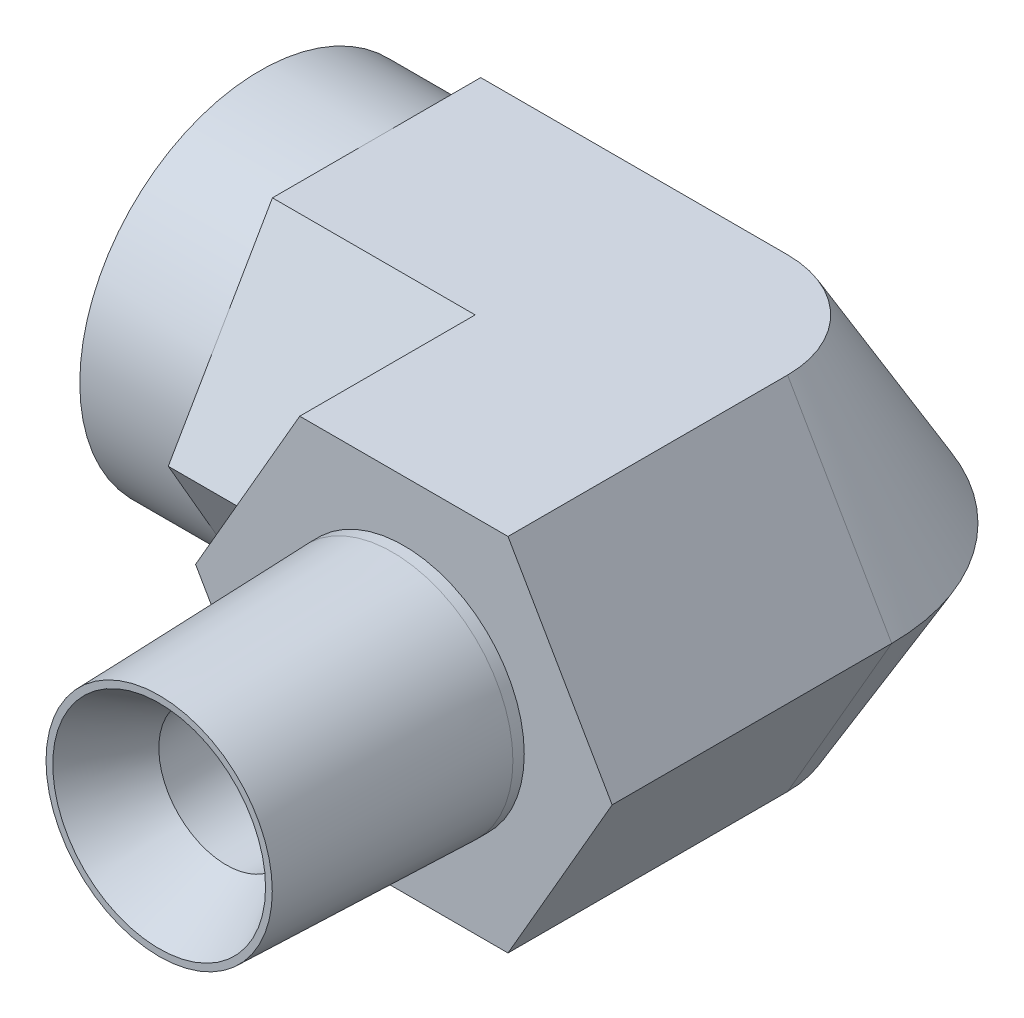
ISO-10303-21;
HEADER;
FILE_DESCRIPTION(('STEP AP214'),'2;1');
FILE_NAME('part.step','',(''),(''),'','','');
FILE_SCHEMA(('AUTOMOTIVE_DESIGN { 1 0 10303 214 1 1 1 1 }'));
ENDSEC;
DATA;
#1=APPLICATION_CONTEXT('core data for automotive mechanical design processes');
#2=APPLICATION_PROTOCOL_DEFINITION('international standard','automotive_design',2000,#1);
#3=PRODUCT_CONTEXT('',#1,'mechanical');
#4=PRODUCT('Part','Part','',(#3));
#5=PRODUCT_RELATED_PRODUCT_CATEGORY('part','',(#4));
#6=PRODUCT_DEFINITION_FORMATION('','',#4);
#7=PRODUCT_DEFINITION_CONTEXT('part definition',#1,'design');
#8=PRODUCT_DEFINITION('design','',#6,#7);
#9=PRODUCT_DEFINITION_SHAPE('','',#8);
#10=(LENGTH_UNIT() NAMED_UNIT(*) SI_UNIT(.MILLI.,.METRE.));
#11=(NAMED_UNIT(*) PLANE_ANGLE_UNIT() SI_UNIT($,.RADIAN.));
#12=(NAMED_UNIT(*) SI_UNIT($,.STERADIAN.) SOLID_ANGLE_UNIT());
#13=UNCERTAINTY_MEASURE_WITH_UNIT(LENGTH_MEASURE(1.E-05),#10,'distance_accuracy_value','');
#14=(GEOMETRIC_REPRESENTATION_CONTEXT(3) GLOBAL_UNCERTAINTY_ASSIGNED_CONTEXT((#13)) GLOBAL_UNIT_ASSIGNED_CONTEXT((#10,
#11,#12)) REPRESENTATION_CONTEXT('',''));
#15=CARTESIAN_POINT('',(0.,0.,0.));
#16=DIRECTION('',(0.,0.,1.));
#17=DIRECTION('',(1.,0.,0.));
#18=AXIS2_PLACEMENT_3D('',#15,#16,#17);
#19=CARTESIAN_POINT('',(-16.2052,0.,0.));
#20=DIRECTION('',(1.,0.,0.));
#21=DIRECTION('',(0.,0.,-1.));
#22=AXIS2_PLACEMENT_3D('',#19,#20,#21);
#23=CYLINDRICAL_SURFACE('',#22,3.5687);
#24=CARTESIAN_POINT('',(0.,0.,0.));
#25=DIRECTION('',(0.707106781186547,0.,0.707106781186547));
#26=DIRECTION('',(0.707106781186547,0.,-0.707106781186547));
#27=AXIS2_PLACEMENT_3D('',#24,#25,#26);
#28=ELLIPSE('',#27,5.04690394004086,3.5687);
#29=CARTESIAN_POINT('',(3.5687,0.,-3.5687));
#30=VERTEX_POINT('',#29);
#31=EDGE_CURVE('E19',#30,#30,#28,.T.);
#32=ORIENTED_EDGE('',*,*,#31,.T.);
#33=EDGE_LOOP('',(#32));
#34=FACE_BOUND('',#33,.T.);
#35=CARTESIAN_POINT('',(-13.716,0.,0.));
#36=DIRECTION('',(1.,0.,0.));
#37=DIRECTION('',(0.,0.,-1.));
#38=AXIS2_PLACEMENT_3D('',#35,#36,#37);
#39=CIRCLE('',#38,3.5687);
#40=CARTESIAN_POINT('',(-13.716,0.,-3.5687));
#41=VERTEX_POINT('',#40);
#42=EDGE_CURVE('E179',#41,#41,#39,.F.);
#43=ORIENTED_EDGE('',*,*,#42,.T.);
#44=EDGE_LOOP('',(#43));
#45=FACE_BOUND('',#44,.T.);
#46=ADVANCED_FACE('F16',(#34,#45),#23,.F.);
#47=CARTESIAN_POINT('',(0.,0.,28.3321125));
#48=DIRECTION('',(0.,0.,-1.));
#49=DIRECTION('',(-1.,0.,0.));
#50=AXIS2_PLACEMENT_3D('',#47,#48,#49);
#51=CYLINDRICAL_SURFACE('',#50,3.5687);
#52=ORIENTED_EDGE('',*,*,#31,.F.);
#53=EDGE_LOOP('',(#52));
#54=FACE_BOUND('',#53,.T.);
#55=CARTESIAN_POINT('',(0.,0.,24.134203093638));
#56=DIRECTION('',(0.,0.,1.));
#57=DIRECTION('',(0.,1.,0.));
#58=AXIS2_PLACEMENT_3D('',#55,#56,#57);
#59=CIRCLE('',#58,3.56870000001663);
#60=CARTESIAN_POINT('',(0.,3.56870000001663,24.134203093638));
#61=VERTEX_POINT('',#60);
#62=EDGE_CURVE('E178',#61,#61,#59,.T.);
#63=ORIENTED_EDGE('',*,*,#62,.T.);
#64=EDGE_LOOP('',(#63));
#65=FACE_BOUND('',#64,.T.);
#66=ADVANCED_FACE('F189',(#54,#65),#51,.F.);
#67=CARTESIAN_POINT('',(-13.716,0.,0.));
#68=DIRECTION('',(-1.,0.,0.));
#69=DIRECTION('',(0.,0.,1.));
#70=AXIS2_PLACEMENT_3D('',#67,#68,#69);
#71=PLANE('',#70);
#72=ORIENTED_EDGE('',*,*,#42,.F.);
#73=EDGE_LOOP('',(#72));
#74=FACE_BOUND('',#73,.T.);
#75=CARTESIAN_POINT('',(-13.7159999999881,0.,0.));
#76=DIRECTION('',(-1.,0.,0.));
#77=DIRECTION('',(0.,0.,1.));
#78=AXIS2_PLACEMENT_3D('',#75,#76,#77);
#79=CIRCLE('',#78,5.97486862599616);
#80=CARTESIAN_POINT('',(-13.7159999999881,0.,5.97486862599616));
#81=VERTEX_POINT('',#80);
#82=EDGE_CURVE('E176',#81,#81,#79,.T.);
#83=ORIENTED_EDGE('',*,*,#82,.T.);
#84=EDGE_LOOP('',(#83));
#85=FACE_BOUND('',#84,.T.);
#86=ADVANCED_FACE('F192',(#74,#85),#71,.T.);
#87=CARTESIAN_POINT('',(0.,0.,27.6859999997896));
#88=DIRECTION('',(0.,0.,1.));
#89=DIRECTION('',(1.,0.,0.));
#90=AXIS2_PLACEMENT_3D('',#87,#88,#89);
#91=CONICAL_SURFACE('',#90,5.61933089983313,0.523598775582548);
#92=ORIENTED_EDGE('',*,*,#62,.F.);
#93=EDGE_LOOP('',(#92));
#94=FACE_BOUND('',#93,.T.);
#95=CARTESIAN_POINT('',(0.,0.,27.6859999999601));
#96=DIRECTION('',(0.,0.,1.));
#97=DIRECTION('',(1.,0.,0.));
#98=AXIS2_PLACEMENT_3D('',#95,#96,#97);
#99=CIRCLE('',#98,5.61933089993159);
#100=CARTESIAN_POINT('',(5.61933089993159,0.,27.6859999999601));
#101=VERTEX_POINT('',#100);
#102=EDGE_CURVE('E173',#101,#101,#99,.T.);
#103=ORIENTED_EDGE('',*,*,#102,.T.);
#104=EDGE_LOOP('',(#103));
#105=FACE_BOUND('',#104,.T.);
#106=ADVANCED_FACE('F195',(#94,#105),#91,.F.);
#107=CARTESIAN_POINT('',(-22.352000000069,0.,0.));
#108=DIRECTION('',(-1.,0.,0.));
#109=DIRECTION('',(0.,0.,1.));
#110=AXIS2_PLACEMENT_3D('',#107,#108,#109);
#111=CONICAL_SURFACE('',#110,6.24370100000071,0.0311192205628758);
#112=ORIENTED_EDGE('',*,*,#82,.F.);
#113=EDGE_LOOP('',(#112));
#114=FACE_BOUND('',#113,.T.);
#115=CARTESIAN_POINT('',(-22.3520000000121,0.,0.));
#116=DIRECTION('',(-1.,0.,0.));
#117=DIRECTION('',(0.,0.,1.));
#118=AXIS2_PLACEMENT_3D('',#115,#116,#117);
#119=CIRCLE('',#118,6.24370099999894);
#120=CARTESIAN_POINT('',(-22.3520000000121,0.,6.24370099999894));
#121=VERTEX_POINT('',#120);
#122=EDGE_CURVE('E170',#121,#121,#119,.T.);
#123=ORIENTED_EDGE('',*,*,#122,.T.);
#124=EDGE_LOOP('',(#123));
#125=FACE_BOUND('',#124,.T.);
#126=ADVANCED_FACE('F198',(#114,#125),#111,.F.);
#127=CARTESIAN_POINT('',(0.,0.,27.686));
#128=DIRECTION('',(0.,0.,-1.));
#129=DIRECTION('',(-1.,0.,0.));
#130=AXIS2_PLACEMENT_3D('',#127,#128,#129);
#131=PLANE('',#130);
#132=ORIENTED_EDGE('',*,*,#102,.F.);
#133=EDGE_LOOP('',(#132));
#134=FACE_BOUND('',#133,.T.);
#135=CARTESIAN_POINT('',(0.,0.,27.686000000017));
#136=DIRECTION('',(0.,0.,-1.));
#137=DIRECTION('',(-1.,0.,0.));
#138=AXIS2_PLACEMENT_3D('',#135,#136,#137);
#139=CIRCLE('',#138,5.97486862599795);
#140=CARTESIAN_POINT('',(-5.97486862599795,0.,27.686000000017));
#141=VERTEX_POINT('',#140);
#142=EDGE_CURVE('E166',#141,#141,#139,.F.);
#143=ORIENTED_EDGE('',*,*,#142,.T.);
#144=EDGE_LOOP('',(#143));
#145=FACE_BOUND('',#144,.T.);
#146=ADVANCED_FACE('F202',(#134,#145),#131,.F.);
#147=CARTESIAN_POINT('',(-22.352,0.,0.));
#148=DIRECTION('',(1.,0.,0.));
#149=DIRECTION('',(0.,0.,-1.));
#150=AXIS2_PLACEMENT_3D('',#147,#148,#149);
#151=PLANE('',#150);
#152=ORIENTED_EDGE('',*,*,#122,.F.);
#153=EDGE_LOOP('',(#152));
#154=FACE_BOUND('',#153,.T.);
#155=CARTESIAN_POINT('',(-22.352,0.,0.));
#156=DIRECTION('',(1.,0.,0.));
#157=DIRECTION('',(0.,0.,-1.));
#158=AXIS2_PLACEMENT_3D('',#155,#156,#157);
#159=CIRCLE('',#158,9.525);
#160=CARTESIAN_POINT('',(-22.352,0.,-9.525));
#161=VERTEX_POINT('',#160);
#162=EDGE_CURVE('E160',#161,#161,#159,.F.);
#163=ORIENTED_EDGE('',*,*,#162,.T.);
#164=EDGE_LOOP('',(#163));
#165=FACE_BOUND('',#164,.T.);
#166=ADVANCED_FACE('F205',(#154,#165),#151,.F.);
#167=CARTESIAN_POINT('',(-16.2052,0.,0.));
#168=DIRECTION('',(-1.,0.,0.));
#169=DIRECTION('',(0.,0.,1.));
#170=AXIS2_PLACEMENT_3D('',#167,#168,#169);
#171=PLANE('',#170);
#172=DIRECTION('',(0.,0.,1.));
#173=VECTOR('',#172,1.);
#174=CARTESIAN_POINT('',(-16.2052,9.525,14.76375));
#175=LINE('',#174,#173);
#176=CARTESIAN_POINT('',(-16.2052,9.52499999999993,5.49926131403082));
#177=VERTEX_POINT('',#176);
#178=CARTESIAN_POINT('',(-16.2052,9.525,0.));
#179=VERTEX_POINT('',#178);
#180=EDGE_CURVE('E235',#177,#179,#175,.F.);
#181=ORIENTED_EDGE('',*,*,#180,.T.);
#182=CARTESIAN_POINT('',(-16.2052,0.,0.));
#183=DIRECTION('',(1.,0.,0.));
#184=DIRECTION('',(0.,0.,-1.));
#185=AXIS2_PLACEMENT_3D('',#182,#183,#184);
#186=CIRCLE('',#185,9.525);
#187=CARTESIAN_POINT('',(-16.2052,4.76249999999975,8.24889197104661));
#188=VERTEX_POINT('',#187);
#189=EDGE_CURVE('E163',#179,#188,#186,.T.);
#190=ORIENTED_EDGE('',*,*,#189,.T.);
#191=DIRECTION('',(0.,-0.866025403784429,0.500000000000017));
#192=VECTOR('',#191,1.);
#193=CARTESIAN_POINT('',(-16.2052,0.,10.9985226280619));
#194=LINE('',#193,#192);
#195=EDGE_CURVE('E241',#188,#177,#194,.F.);
#196=ORIENTED_EDGE('',*,*,#195,.T.);
#197=EDGE_LOOP('',(#181,#190,#196));
#198=FACE_BOUND('',#197,.T.);
#199=ADVANCED_FACE('F293',(#198),#171,.T.);
#200=CARTESIAN_POINT('',(-16.2052,0.,0.));
#201=DIRECTION('',(-1.,0.,0.));
#202=DIRECTION('',(0.,0.,1.));
#203=AXIS2_PLACEMENT_3D('',#200,#201,#202);
#204=PLANE('',#203);
#205=DIRECTION('',(0.,0.866025403784429,0.500000000000017));
#206=VECTOR('',#205,1.);
#207=CARTESIAN_POINT('',(-16.2052,9.525,-5.49926131403094));
#208=LINE('',#207,#206);
#209=CARTESIAN_POINT('',(-16.2052,9.525,-5.49926131403094));
#210=VERTEX_POINT('',#209);
#211=CARTESIAN_POINT('',(-16.2052,4.76250000000041,-8.24889197104693));
#212=VERTEX_POINT('',#211);
#213=EDGE_CURVE('E231',#210,#212,#208,.F.);
#214=ORIENTED_EDGE('',*,*,#213,.T.);
#215=CARTESIAN_POINT('',(-16.2052,0.,0.));
#216=DIRECTION('',(1.,0.,0.));
#217=DIRECTION('',(0.,0.,-1.));
#218=AXIS2_PLACEMENT_3D('',#215,#216,#217);
#219=CIRCLE('',#218,9.525);
#220=EDGE_CURVE('E131',#212,#179,#219,.T.);
#221=ORIENTED_EDGE('',*,*,#220,.T.);
#222=DIRECTION('',(0.,0.,1.));
#223=VECTOR('',#222,1.);
#224=CARTESIAN_POINT('',(-16.2052,9.525,14.76375));
#225=LINE('',#224,#223);
#226=EDGE_CURVE('E226',#179,#210,#225,.F.);
#227=ORIENTED_EDGE('',*,*,#226,.T.);
#228=EDGE_LOOP('',(#214,#221,#227));
#229=FACE_BOUND('',#228,.T.);
#230=ADVANCED_FACE('F213',(#229),#204,.T.);
#231=CARTESIAN_POINT('',(0.,0.,15.3634440000019));
#232=DIRECTION('',(0.,0.,-1.));
#233=DIRECTION('',(-1.,0.,0.));
#234=AXIS2_PLACEMENT_3D('',#231,#232,#233);
#235=CONICAL_SURFACE('',#234,6.35846079636337,0.0311192205630518);
#236=ORIENTED_EDGE('',*,*,#142,.F.);
#237=EDGE_LOOP('',(#236));
#238=FACE_BOUND('',#237,.T.);
#239=CARTESIAN_POINT('',(0.,0.,15.363444));
#240=DIRECTION('',(0.,0.,-1.));
#241=DIRECTION('',(-1.,0.,0.));
#242=AXIS2_PLACEMENT_3D('',#239,#240,#241);
#243=CIRCLE('',#242,6.3584607963626);
#244=CARTESIAN_POINT('',(-6.3584607963626,0.,15.363444));
#245=VERTEX_POINT('',#244);
#246=EDGE_CURVE('E217',#245,#245,#243,.F.);
#247=ORIENTED_EDGE('',*,*,#246,.T.);
#248=EDGE_LOOP('',(#247));
#249=FACE_BOUND('',#248,.T.);
#250=ADVANCED_FACE('F209',(#238,#249),#235,.T.);
#251=CARTESIAN_POINT('',(0.,3.3133218391157E-13,0.));
#252=DIRECTION('',(0.,-1.,0.));
#253=DIRECTION('',(0.,0.,-1.));
#254=AXIS2_PLACEMENT_3D('',#251,#252,#253);
#255=CONICAL_SURFACE('',#254,10.9985226280625,0.5235987755982);
#256=CARTESIAN_POINT('',(0.,-3.33066907387547E-13,0.));
#257=DIRECTION('',(0.,1.,0.));
#258=DIRECTION('',(1.,0.,0.));
#259=AXIS2_PLACEMENT_3D('',#256,#257,#258);
#260=CIRCLE('',#259,10.9985226280625);
#261=CARTESIAN_POINT('',(10.9985226280621,0.,0.));
#262=VERTEX_POINT('',#261);
#263=CARTESIAN_POINT('',(0.,0.,-10.9985226280621));
#264=VERTEX_POINT('',#263);
#265=EDGE_CURVE('E262',#262,#264,#260,.T.);
#266=ORIENTED_EDGE('',*,*,#265,.T.);
#267=DIRECTION('',(0.,0.866025403784429,0.500000000000017));
#268=VECTOR('',#267,1.);
#269=CARTESIAN_POINT('',(0.,9.525,-5.49926131403094));
#270=LINE('',#269,#268);
#271=CARTESIAN_POINT('',(0.,9.52500000000038,-5.49926131403072));
#272=VERTEX_POINT('',#271);
#273=EDGE_CURVE('E169',#264,#272,#270,.T.);
#274=ORIENTED_EDGE('',*,*,#273,.T.);
#275=CARTESIAN_POINT('',(0.,9.52500000000077,0.));
#276=DIRECTION('',(0.,-1.,0.));
#277=DIRECTION('',(0.,0.,-1.));
#278=AXIS2_PLACEMENT_3D('',#275,#276,#277);
#279=CIRCLE('',#278,5.49926131403227);
#280=CARTESIAN_POINT('',(5.49926131403072,9.52500000000038,0.));
#281=VERTEX_POINT('',#280);
#282=EDGE_CURVE('E152',#272,#281,#279,.T.);
#283=ORIENTED_EDGE('',*,*,#282,.T.);
#284=DIRECTION('',(-0.500000000000017,0.866025403784429,0.));
#285=VECTOR('',#284,1.);
#286=CARTESIAN_POINT('',(5.49926131403094,9.525,0.));
#287=LINE('',#286,#285);
#288=EDGE_CURVE('E223',#281,#262,#287,.F.);
#289=ORIENTED_EDGE('',*,*,#288,.T.);
#290=EDGE_LOOP('',(#266,#274,#283,#289));
#291=FACE_BOUND('',#290,.T.);
#292=ADVANCED_FACE('F212',(#291),#255,.T.);
#293=CARTESIAN_POINT('',(0.,9.525,-5.49926131403094));
#294=DIRECTION('',(0.,0.500000000000017,-0.866025403784429));
#295=DIRECTION('',(0.,0.866025403784429,0.500000000000017));
#296=AXIS2_PLACEMENT_3D('',#293,#294,#295);
#297=PLANE('',#296);
#298=ORIENTED_EDGE('',*,*,#213,.F.);
#299=DIRECTION('',(1.,0.,0.));
#300=VECTOR('',#299,1.);
#301=CARTESIAN_POINT('',(-5.49926131403094,9.525,-5.49926131403094));
#302=LINE('',#301,#300);
#303=EDGE_CURVE('E220',#210,#272,#302,.T.);
#304=ORIENTED_EDGE('',*,*,#303,.T.);
#305=ORIENTED_EDGE('',*,*,#273,.F.);
#306=DIRECTION('',(1.,0.,0.));
#307=VECTOR('',#306,1.);
#308=CARTESIAN_POINT('',(0.,0.,-10.9985226280619));
#309=LINE('',#308,#307);
#310=CARTESIAN_POINT('',(-16.2052,4.37400873697347E-13,-10.9985226280621));
#311=VERTEX_POINT('',#310);
#312=EDGE_CURVE('E123',#264,#311,#309,.F.);
#313=ORIENTED_EDGE('',*,*,#312,.T.);
#314=DIRECTION('',(0.,0.866025403784429,0.500000000000017));
#315=VECTOR('',#314,1.);
#316=CARTESIAN_POINT('',(-16.2052,2.65781840980139E-13,-10.9985226280632));
#317=LINE('',#316,#315);
#318=EDGE_CURVE('E118',#311,#212,#317,.T.);
#319=ORIENTED_EDGE('',*,*,#318,.T.);
#320=EDGE_LOOP('',(#298,#304,#305,#313,#319));
#321=FACE_BOUND('',#320,.T.);
#322=ADVANCED_FACE('F282',(#321),#297,.T.);
#323=CARTESIAN_POINT('',(-16.2052,0.,0.));
#324=DIRECTION('',(-1.,0.,0.));
#325=DIRECTION('',(0.,0.,1.));
#326=AXIS2_PLACEMENT_3D('',#323,#324,#325);
#327=PLANE('',#326);
#328=DIRECTION('',(0.,0.866025403784429,-0.500000000000017));
#329=VECTOR('',#328,1.);
#330=CARTESIAN_POINT('',(-16.2052,0.,-10.9985226280619));
#331=LINE('',#330,#329);
#332=CARTESIAN_POINT('',(-16.2052,-4.76249999999995,-8.24889197104695));
#333=VERTEX_POINT('',#332);
#334=EDGE_CURVE('E112',#311,#333,#331,.F.);
#335=ORIENTED_EDGE('',*,*,#334,.T.);
#336=CARTESIAN_POINT('',(-16.2052,0.,0.));
#337=DIRECTION('',(1.,0.,0.));
#338=DIRECTION('',(0.,0.,-1.));
#339=AXIS2_PLACEMENT_3D('',#336,#337,#338);
#340=CIRCLE('',#339,9.525);
#341=EDGE_CURVE('E115',#333,#212,#340,.T.);
#342=ORIENTED_EDGE('',*,*,#341,.T.);
#343=ORIENTED_EDGE('',*,*,#318,.F.);
#344=EDGE_LOOP('',(#335,#342,#343));
#345=FACE_BOUND('',#344,.T.);
#346=ADVANCED_FACE('F114',(#345),#327,.T.);
#347=CARTESIAN_POINT('',(-22.65934,0.,0.));
#348=DIRECTION('',(1.,0.,0.));
#349=DIRECTION('',(0.,0.,-1.));
#350=AXIS2_PLACEMENT_3D('',#347,#348,#349);
#351=CYLINDRICAL_SURFACE('',#350,9.525);
#352=ORIENTED_EDGE('',*,*,#162,.F.);
#353=EDGE_LOOP('',(#352));
#354=FACE_BOUND('',#353,.T.);
#355=CARTESIAN_POINT('',(-16.2052,0.,0.));
#356=DIRECTION('',(1.,0.,0.));
#357=DIRECTION('',(0.,0.,-1.));
#358=AXIS2_PLACEMENT_3D('',#355,#356,#357);
#359=CIRCLE('',#358,9.525);
#360=CARTESIAN_POINT('',(-16.2052,-9.525,0.));
#361=VERTEX_POINT('',#360);
#362=EDGE_CURVE('E128',#333,#361,#359,.F.);
#363=ORIENTED_EDGE('',*,*,#362,.T.);
#364=CARTESIAN_POINT('',(-16.2052,0.,0.));
#365=DIRECTION('',(1.,0.,0.));
#366=DIRECTION('',(0.,0.,-1.));
#367=AXIS2_PLACEMENT_3D('',#364,#365,#366);
#368=CIRCLE('',#367,9.525);
#369=CARTESIAN_POINT('',(-16.2052,-4.76249999999985,8.2488919710468));
#370=VERTEX_POINT('',#369);
#371=EDGE_CURVE('E141',#361,#370,#368,.F.);
#372=ORIENTED_EDGE('',*,*,#371,.T.);
#373=CARTESIAN_POINT('',(-16.2052,0.,0.));
#374=DIRECTION('',(1.,0.,0.));
#375=DIRECTION('',(0.,0.,-1.));
#376=AXIS2_PLACEMENT_3D('',#373,#374,#375);
#377=CIRCLE('',#376,9.525);
#378=EDGE_CURVE('E156',#370,#188,#377,.F.);
#379=ORIENTED_EDGE('',*,*,#378,.T.);
#380=ORIENTED_EDGE('',*,*,#189,.F.);
#381=ORIENTED_EDGE('',*,*,#220,.F.);
#382=ORIENTED_EDGE('',*,*,#341,.F.);
#383=EDGE_LOOP('',(#363,#372,#379,#380,#381,#382));
#384=FACE_BOUND('',#383,.T.);
#385=ADVANCED_FACE('F126',(#354,#384),#351,.T.);
#386=CARTESIAN_POINT('',(-16.2052,0.,0.));
#387=DIRECTION('',(-1.,0.,0.));
#388=DIRECTION('',(0.,0.,1.));
#389=AXIS2_PLACEMENT_3D('',#386,#387,#388);
#390=PLANE('',#389);
#391=DIRECTION('',(0.,-0.866025403784429,0.500000000000017));
#392=VECTOR('',#391,1.);
#393=CARTESIAN_POINT('',(-16.2052,0.,10.9985226280619));
#394=LINE('',#393,#392);
#395=CARTESIAN_POINT('',(-16.2052,-2.45163672640271E-13,10.9985226280622));
#396=VERTEX_POINT('',#395);
#397=EDGE_CURVE('E159',#396,#188,#394,.F.);
#398=ORIENTED_EDGE('',*,*,#397,.T.);
#399=ORIENTED_EDGE('',*,*,#378,.F.);
#400=DIRECTION('',(0.,-0.866025403784429,-0.500000000000017));
#401=VECTOR('',#400,1.);
#402=CARTESIAN_POINT('',(-16.2052,-9.525,5.49926131403094));
#403=LINE('',#402,#401);
#404=EDGE_CURVE('E275',#370,#396,#403,.F.);
#405=ORIENTED_EDGE('',*,*,#404,.T.);
#406=EDGE_LOOP('',(#398,#399,#405));
#407=FACE_BOUND('',#406,.T.);
#408=ADVANCED_FACE('F300',(#407),#390,.T.);
#409=CARTESIAN_POINT('',(0.,0.,10.9985226280619));
#410=DIRECTION('',(0.,0.500000000000017,0.866025403784429));
#411=DIRECTION('',(0.,-0.866025403784429,0.500000000000017));
#412=AXIS2_PLACEMENT_3D('',#409,#410,#411);
#413=PLANE('',#412);
#414=DIRECTION('',(0.447213595499968,0.774596669241466,-0.447213595499977));
#415=VECTOR('',#414,1.);
#416=CARTESIAN_POINT('',(-10.9985226280619,0.,10.9985226280619));
#417=LINE('',#416,#415);
#418=CARTESIAN_POINT('',(-10.9985226280622,-2.64516620180819E-13,10.9985226280623));
#419=VERTEX_POINT('',#418);
#420=CARTESIAN_POINT('',(-5.49926131403082,9.52499999999993,5.49926131403078));
#421=VERTEX_POINT('',#420);
#422=EDGE_CURVE('E155',#419,#421,#417,.T.);
#423=ORIENTED_EDGE('',*,*,#422,.T.);
#424=DIRECTION('',(1.,0.,0.));
#425=VECTOR('',#424,1.);
#426=CARTESIAN_POINT('',(-5.49926131403094,9.525,5.49926131403094));
#427=LINE('',#426,#425);
#428=EDGE_CURVE('E238',#421,#177,#427,.F.);
#429=ORIENTED_EDGE('',*,*,#428,.T.);
#430=ORIENTED_EDGE('',*,*,#195,.F.);
#431=ORIENTED_EDGE('',*,*,#397,.F.);
#432=DIRECTION('',(1.,0.,0.));
#433=VECTOR('',#432,1.);
#434=CARTESIAN_POINT('',(0.,-2.09901540593194E-13,10.9985226280622));
#435=LINE('',#434,#433);
#436=EDGE_CURVE('E273',#396,#419,#435,.T.);
#437=ORIENTED_EDGE('',*,*,#436,.T.);
#438=EDGE_LOOP('',(#423,#429,#430,#431,#437));
#439=FACE_BOUND('',#438,.T.);
#440=ADVANCED_FACE('F303',(#439),#413,.T.);
#441=CARTESIAN_POINT('',(-10.9985226280619,0.,14.76375));
#442=DIRECTION('',(-0.866025403784429,0.500000000000017,0.));
#443=DIRECTION('',(-0.500000000000017,-0.866025403784429,0.));
#444=AXIS2_PLACEMENT_3D('',#441,#442,#443);
#445=PLANE('',#444);
#446=ORIENTED_EDGE('',*,*,#422,.F.);
#447=DIRECTION('',(0.,0.,1.));
#448=VECTOR('',#447,1.);
#449=CARTESIAN_POINT('',(-10.9985226280622,-2.09901540593194E-13,14.76375));
#450=LINE('',#449,#448);
#451=CARTESIAN_POINT('',(-10.9985226280622,-3.53787086321082E-13,14.76375));
#452=VERTEX_POINT('',#451);
#453=EDGE_CURVE('E269',#419,#452,#450,.T.);
#454=ORIENTED_EDGE('',*,*,#453,.T.);
#455=DIRECTION('',(0.500000000000017,0.866025403784429,0.));
#456=VECTOR('',#455,1.);
#457=CARTESIAN_POINT('',(-10.9985226280619,0.,14.76375));
#458=LINE('',#457,#456);
#459=CARTESIAN_POINT('',(-5.49926131403061,9.525,14.76375));
#460=VERTEX_POINT('',#459);
#461=EDGE_CURVE('E259',#452,#460,#458,.T.);
#462=ORIENTED_EDGE('',*,*,#461,.T.);
#463=DIRECTION('',(0.,0.,1.));
#464=VECTOR('',#463,1.);
#465=CARTESIAN_POINT('',(-5.49926131403094,9.525,14.76375));
#466=LINE('',#465,#464);
#467=EDGE_CURVE('E154',#460,#421,#466,.F.);
#468=ORIENTED_EDGE('',*,*,#467,.T.);
#469=EDGE_LOOP('',(#446,#454,#462,#468));
#470=FACE_BOUND('',#469,.T.);
#471=ADVANCED_FACE('F366',(#470),#445,.T.);
#472=CARTESIAN_POINT('',(-5.49926131403094,9.525,14.76375));
#473=DIRECTION('',(0.,1.,0.));
#474=DIRECTION('',(0.,0.,1.));
#475=AXIS2_PLACEMENT_3D('',#472,#473,#474);
#476=PLANE('',#475);
#477=ORIENTED_EDGE('',*,*,#226,.F.);
#478=ORIENTED_EDGE('',*,*,#180,.F.);
#479=ORIENTED_EDGE('',*,*,#428,.F.);
#480=ORIENTED_EDGE('',*,*,#467,.F.);
#481=DIRECTION('',(-1.,0.,0.));
#482=VECTOR('',#481,1.);
#483=CARTESIAN_POINT('',(0.,9.525,14.76375));
#484=LINE('',#483,#482);
#485=CARTESIAN_POINT('',(5.49926131403094,9.525,14.76375));
#486=VERTEX_POINT('',#485);
#487=EDGE_CURVE('E254',#460,#486,#484,.F.);
#488=ORIENTED_EDGE('',*,*,#487,.T.);
#489=DIRECTION('',(0.,0.,1.));
#490=VECTOR('',#489,1.);
#491=CARTESIAN_POINT('',(5.49926131403094,9.525,14.76375));
#492=LINE('',#491,#490);
#493=EDGE_CURVE('E219',#486,#281,#492,.F.);
#494=ORIENTED_EDGE('',*,*,#493,.T.);
#495=ORIENTED_EDGE('',*,*,#282,.F.);
#496=ORIENTED_EDGE('',*,*,#303,.F.);
#497=EDGE_LOOP('',(#477,#478,#479,#480,#488,#494,#495,#496));
#498=FACE_BOUND('',#497,.T.);
#499=ADVANCED_FACE('F289',(#498),#476,.T.);
#500=CARTESIAN_POINT('',(0.,0.,28.3321125));
#501=DIRECTION('',(0.,0.,-1.));
#502=DIRECTION('',(-1.,0.,0.));
#503=AXIS2_PLACEMENT_3D('',#500,#501,#502);
#504=CYLINDRICAL_SURFACE('',#503,6.3584607963626);
#505=ORIENTED_EDGE('',*,*,#246,.F.);
#506=EDGE_LOOP('',(#505));
#507=FACE_BOUND('',#506,.T.);
#508=CARTESIAN_POINT('',(0.,0.,14.76375));
#509=DIRECTION('',(0.,0.,-1.));
#510=DIRECTION('',(-1.,0.,0.));
#511=AXIS2_PLACEMENT_3D('',#508,#509,#510);
#512=CIRCLE('',#511,6.3584607963626);
#513=CARTESIAN_POINT('',(-6.3584607963626,0.,14.76375));
#514=VERTEX_POINT('',#513);
#515=EDGE_CURVE('E245',#514,#514,#512,.F.);
#516=ORIENTED_EDGE('',*,*,#515,.T.);
#517=EDGE_LOOP('',(#516));
#518=FACE_BOUND('',#517,.T.);
#519=ADVANCED_FACE('F361',(#507,#518),#504,.T.);
#520=CARTESIAN_POINT('',(5.49926131403094,9.525,14.76375));
#521=DIRECTION('',(0.866025403784429,0.500000000000017,0.));
#522=DIRECTION('',(-0.500000000000017,0.866025403784429,0.));
#523=AXIS2_PLACEMENT_3D('',#520,#521,#522);
#524=PLANE('',#523);
#525=ORIENTED_EDGE('',*,*,#493,.F.);
#526=DIRECTION('',(0.500000000000017,-0.866025403784429,0.));
#527=VECTOR('',#526,1.);
#528=CARTESIAN_POINT('',(5.49926131403094,9.525,14.76375));
#529=LINE('',#528,#527);
#530=CARTESIAN_POINT('',(10.998522628062,0.,14.76375));
#531=VERTEX_POINT('',#530);
#532=EDGE_CURVE('E248',#486,#531,#529,.T.);
#533=ORIENTED_EDGE('',*,*,#532,.T.);
#534=DIRECTION('',(0.,0.,1.));
#535=VECTOR('',#534,1.);
#536=CARTESIAN_POINT('',(10.9985226280619,0.,14.76375));
#537=LINE('',#536,#535);
#538=EDGE_CURVE('E247',#531,#262,#537,.F.);
#539=ORIENTED_EDGE('',*,*,#538,.T.);
#540=ORIENTED_EDGE('',*,*,#288,.F.);
#541=EDGE_LOOP('',(#525,#533,#539,#540));
#542=FACE_BOUND('',#541,.T.);
#543=ADVANCED_FACE('F318',(#542),#524,.T.);
#544=CARTESIAN_POINT('',(0.,-3.3133218391157E-13,0.));
#545=DIRECTION('',(0.,1.,0.));
#546=DIRECTION('',(0.,0.,1.));
#547=AXIS2_PLACEMENT_3D('',#544,#545,#546);
#548=CONICAL_SURFACE('',#547,10.9985226280625,0.5235987755982);
#549=ORIENTED_EDGE('',*,*,#265,.F.);
#550=DIRECTION('',(0.500000000000017,0.866025403784429,0.));
#551=VECTOR('',#550,1.);
#552=CARTESIAN_POINT('',(10.9985226280619,0.,0.));
#553=LINE('',#552,#551);
#554=CARTESIAN_POINT('',(5.49926131403038,-9.52500000000033,0.));
#555=VERTEX_POINT('',#554);
#556=EDGE_CURVE('E252',#262,#555,#553,.F.);
#557=ORIENTED_EDGE('',*,*,#556,.T.);
#558=CARTESIAN_POINT('',(0.,-9.52500000000077,0.));
#559=DIRECTION('',(0.,1.,0.));
#560=DIRECTION('',(0.,0.,1.));
#561=AXIS2_PLACEMENT_3D('',#558,#559,#560);
#562=CIRCLE('',#561,5.49926131403227);
#563=CARTESIAN_POINT('',(0.,-9.52500000000033,-5.49926131403038));
#564=VERTEX_POINT('',#563);
#565=EDGE_CURVE('E243',#555,#564,#562,.T.);
#566=ORIENTED_EDGE('',*,*,#565,.T.);
#567=DIRECTION('',(0.,0.866025403784429,-0.500000000000017));
#568=VECTOR('',#567,1.);
#569=CARTESIAN_POINT('',(0.,0.,-10.9985226280619));
#570=LINE('',#569,#568);
#571=EDGE_CURVE('E122',#564,#264,#570,.T.);
#572=ORIENTED_EDGE('',*,*,#571,.T.);
#573=EDGE_LOOP('',(#549,#557,#566,#572));
#574=FACE_BOUND('',#573,.T.);
#575=ADVANCED_FACE('F320',(#574),#548,.T.);
#576=CARTESIAN_POINT('',(0.,0.,-10.9985226280619));
#577=DIRECTION('',(0.,-0.500000000000017,-0.866025403784429));
#578=DIRECTION('',(0.,0.866025403784429,-0.500000000000017));
#579=AXIS2_PLACEMENT_3D('',#576,#577,#578);
#580=PLANE('',#579);
#581=DIRECTION('',(1.,0.,0.));
#582=VECTOR('',#581,1.);
#583=CARTESIAN_POINT('',(5.49926131403094,-9.525,-5.49926131403094));
#584=LINE('',#583,#582);
#585=CARTESIAN_POINT('',(-16.2052,-9.525,-5.49926131403128));
#586=VERTEX_POINT('',#585);
#587=EDGE_CURVE('E138',#564,#586,#584,.F.);
#588=ORIENTED_EDGE('',*,*,#587,.T.);
#589=DIRECTION('',(0.,0.866025403784429,-0.500000000000017));
#590=VECTOR('',#589,1.);
#591=CARTESIAN_POINT('',(-16.2052,-9.52499999999974,-5.49926131403212));
#592=LINE('',#591,#590);
#593=EDGE_CURVE('E134',#586,#333,#592,.T.);
#594=ORIENTED_EDGE('',*,*,#593,.T.);
#595=ORIENTED_EDGE('',*,*,#334,.F.);
#596=ORIENTED_EDGE('',*,*,#312,.F.);
#597=ORIENTED_EDGE('',*,*,#571,.F.);
#598=EDGE_LOOP('',(#588,#594,#595,#596,#597));
#599=FACE_BOUND('',#598,.T.);
#600=ADVANCED_FACE('F135',(#599),#580,.T.);
#601=CARTESIAN_POINT('',(-16.2052,0.,0.));
#602=DIRECTION('',(-1.,0.,0.));
#603=DIRECTION('',(0.,0.,1.));
#604=AXIS2_PLACEMENT_3D('',#601,#602,#603);
#605=PLANE('',#604);
#606=DIRECTION('',(0.,0.,-1.));
#607=VECTOR('',#606,1.);
#608=CARTESIAN_POINT('',(-16.2052,-9.525,14.76375));
#609=LINE('',#608,#607);
#610=EDGE_CURVE('E144',#586,#361,#609,.F.);
#611=ORIENTED_EDGE('',*,*,#610,.T.);
#612=ORIENTED_EDGE('',*,*,#362,.F.);
#613=ORIENTED_EDGE('',*,*,#593,.F.);
#614=EDGE_LOOP('',(#611,#612,#613));
#615=FACE_BOUND('',#614,.T.);
#616=ADVANCED_FACE('F143',(#615),#605,.T.);
#617=CARTESIAN_POINT('',(-16.2052,0.,0.));
#618=DIRECTION('',(-1.,0.,0.));
#619=DIRECTION('',(0.,0.,1.));
#620=AXIS2_PLACEMENT_3D('',#617,#618,#619);
#621=PLANE('',#620);
#622=DIRECTION('',(0.,-0.866025403784429,-0.500000000000017));
#623=VECTOR('',#622,1.);
#624=CARTESIAN_POINT('',(-16.2052,-9.525,5.49926131403094));
#625=LINE('',#624,#623);
#626=CARTESIAN_POINT('',(-16.2052,-9.525,5.49926131403094));
#627=VERTEX_POINT('',#626);
#628=EDGE_CURVE('E278',#627,#370,#625,.F.);
#629=ORIENTED_EDGE('',*,*,#628,.T.);
#630=ORIENTED_EDGE('',*,*,#371,.F.);
#631=DIRECTION('',(0.,0.,-1.));
#632=VECTOR('',#631,1.);
#633=CARTESIAN_POINT('',(-16.2052,-9.525,14.76375));
#634=LINE('',#633,#632);
#635=EDGE_CURVE('E587',#361,#627,#634,.F.);
#636=ORIENTED_EDGE('',*,*,#635,.T.);
#637=EDGE_LOOP('',(#629,#630,#636));
#638=FACE_BOUND('',#637,.T.);
#639=ADVANCED_FACE('F348',(#638),#621,.T.);
#640=CARTESIAN_POINT('',(0.,-9.525,5.49926131403094));
#641=DIRECTION('',(0.,-0.500000000000017,0.866025403784429));
#642=DIRECTION('',(0.,-0.866025403784429,-0.500000000000017));
#643=AXIS2_PLACEMENT_3D('',#640,#641,#642);
#644=PLANE('',#643);
#645=DIRECTION('',(-0.447213595499968,0.774596669241466,0.447213595499977));
#646=VECTOR('',#645,1.);
#647=CARTESIAN_POINT('',(-5.49926131403094,-9.525,5.49926131403094));
#648=LINE('',#647,#646);
#649=CARTESIAN_POINT('',(-5.49926131403094,-9.525,5.49926131403094));
#650=VERTEX_POINT('',#649);
#651=EDGE_CURVE('E271',#650,#419,#648,.T.);
#652=ORIENTED_EDGE('',*,*,#651,.T.);
#653=ORIENTED_EDGE('',*,*,#436,.F.);
#654=ORIENTED_EDGE('',*,*,#404,.F.);
#655=ORIENTED_EDGE('',*,*,#628,.F.);
#656=DIRECTION('',(1.,0.,0.));
#657=VECTOR('',#656,1.);
#658=CARTESIAN_POINT('',(5.49926131403094,-9.525,5.49926131403094));
#659=LINE('',#658,#657);
#660=EDGE_CURVE('E584',#627,#650,#659,.T.);
#661=ORIENTED_EDGE('',*,*,#660,.T.);
#662=EDGE_LOOP('',(#652,#653,#654,#655,#661));
#663=FACE_BOUND('',#662,.T.);
#664=ADVANCED_FACE('F344',(#663),#644,.T.);
#665=CARTESIAN_POINT('',(-5.49926131403094,-9.525,14.76375));
#666=DIRECTION('',(-0.866025403784429,-0.500000000000017,0.));
#667=DIRECTION('',(0.500000000000017,-0.866025403784429,0.));
#668=AXIS2_PLACEMENT_3D('',#665,#666,#667);
#669=PLANE('',#668);
#670=ORIENTED_EDGE('',*,*,#651,.F.);
#671=DIRECTION('',(0.,0.,-1.));
#672=VECTOR('',#671,1.);
#673=CARTESIAN_POINT('',(-5.49926131403094,-9.525,14.76375));
#674=LINE('',#673,#672);
#675=CARTESIAN_POINT('',(-5.49926131403094,-9.525,14.76375));
#676=VERTEX_POINT('',#675);
#677=EDGE_CURVE('E579',#650,#676,#674,.F.);
#678=ORIENTED_EDGE('',*,*,#677,.T.);
#679=DIRECTION('',(-0.500000000000017,0.866025403784429,0.));
#680=VECTOR('',#679,1.);
#681=CARTESIAN_POINT('',(-5.49926131403094,-9.525,14.76375));
#682=LINE('',#681,#680);
#683=EDGE_CURVE('E268',#676,#452,#682,.T.);
#684=ORIENTED_EDGE('',*,*,#683,.T.);
#685=ORIENTED_EDGE('',*,*,#453,.F.);
#686=EDGE_LOOP('',(#670,#678,#684,#685));
#687=FACE_BOUND('',#686,.T.);
#688=ADVANCED_FACE('F340',(#687),#669,.T.);
#689=CARTESIAN_POINT('',(0.,0.,14.76375));
#690=DIRECTION('',(0.,0.,-1.));
#691=DIRECTION('',(-1.,0.,0.));
#692=AXIS2_PLACEMENT_3D('',#689,#690,#691);
#693=PLANE('',#692);
#694=ORIENTED_EDGE('',*,*,#515,.F.);
#695=EDGE_LOOP('',(#694));
#696=FACE_BOUND('',#695,.T.);
#697=ORIENTED_EDGE('',*,*,#532,.F.);
#698=ORIENTED_EDGE('',*,*,#487,.F.);
#699=ORIENTED_EDGE('',*,*,#461,.F.);
#700=ORIENTED_EDGE('',*,*,#683,.F.);
#701=DIRECTION('',(1.,0.,0.));
#702=VECTOR('',#701,1.);
#703=CARTESIAN_POINT('',(5.49926131403094,-9.525,14.76375));
#704=LINE('',#703,#702);
#705=CARTESIAN_POINT('',(5.49926131403082,-9.52499999999993,14.76375));
#706=VERTEX_POINT('',#705);
#707=EDGE_CURVE('E25',#676,#706,#704,.T.);
#708=ORIENTED_EDGE('',*,*,#707,.T.);
#709=DIRECTION('',(0.500000000000017,0.866025403784429,0.));
#710=VECTOR('',#709,1.);
#711=CARTESIAN_POINT('',(10.9985226280619,0.,14.76375));
#712=LINE('',#711,#710);
#713=EDGE_CURVE('E244',#706,#531,#712,.T.);
#714=ORIENTED_EDGE('',*,*,#713,.T.);
#715=EDGE_LOOP('',(#697,#698,#699,#700,#708,#714));
#716=FACE_BOUND('',#715,.T.);
#717=ADVANCED_FACE('F309',(#696,#716),#693,.F.);
#718=CARTESIAN_POINT('',(10.9985226280619,0.,14.76375));
#719=DIRECTION('',(0.866025403784429,-0.500000000000017,0.));
#720=DIRECTION('',(0.500000000000017,0.866025403784429,0.));
#721=AXIS2_PLACEMENT_3D('',#718,#719,#720);
#722=PLANE('',#721);
#723=DIRECTION('',(0.,0.,-1.));
#724=VECTOR('',#723,1.);
#725=CARTESIAN_POINT('',(5.49926131403094,-9.525,14.76375));
#726=LINE('',#725,#724);
#727=EDGE_CURVE('E11',#706,#555,#726,.T.);
#728=ORIENTED_EDGE('',*,*,#727,.T.);
#729=ORIENTED_EDGE('',*,*,#556,.F.);
#730=ORIENTED_EDGE('',*,*,#538,.F.);
#731=ORIENTED_EDGE('',*,*,#713,.F.);
#732=EDGE_LOOP('',(#728,#729,#730,#731));
#733=FACE_BOUND('',#732,.T.);
#734=ADVANCED_FACE('F315',(#733),#722,.T.);
#735=CARTESIAN_POINT('',(5.49926131403094,-9.525,14.76375));
#736=DIRECTION('',(0.,-1.,0.));
#737=DIRECTION('',(0.,0.,-1.));
#738=AXIS2_PLACEMENT_3D('',#735,#736,#737);
#739=PLANE('',#738);
#740=ORIENTED_EDGE('',*,*,#707,.F.);
#741=ORIENTED_EDGE('',*,*,#677,.F.);
#742=ORIENTED_EDGE('',*,*,#660,.F.);
#743=ORIENTED_EDGE('',*,*,#635,.F.);
#744=ORIENTED_EDGE('',*,*,#610,.F.);
#745=ORIENTED_EDGE('',*,*,#587,.F.);
#746=ORIENTED_EDGE('',*,*,#565,.F.);
#747=ORIENTED_EDGE('',*,*,#727,.F.);
#748=EDGE_LOOP('',(#740,#741,#742,#743,#744,#745,#746,#747));
#749=FACE_BOUND('',#748,.T.);
#750=ADVANCED_FACE('F329',(#749),#739,.T.);
#751=CLOSED_SHELL('',(#46,#66,#86,#106,#126,#146,#166,#199,#230,#250,#292,#322,#346,#385,#408,
#440,#471,#499,#519,#543,#575,#600,#616,#639,#664,#688,#717,#734,#750));
#752=MANIFOLD_SOLID_BREP('B1',#751);
#753=ADVANCED_BREP_SHAPE_REPRESENTATION('',(#18,#752),#14);
#754=SHAPE_DEFINITION_REPRESENTATION(#9,#753);
ENDSEC;
END-ISO-10303-21;
